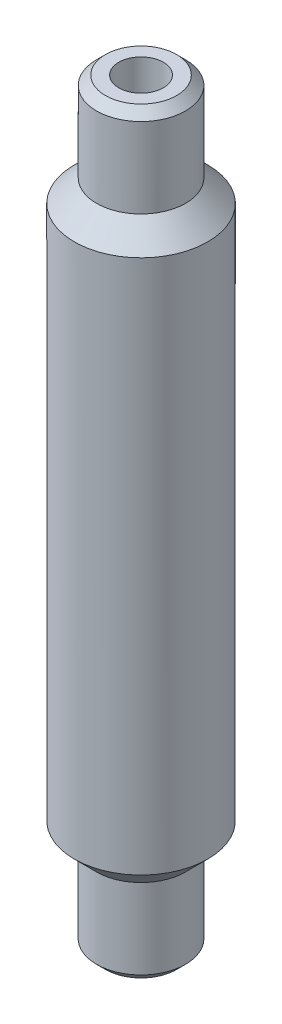
ISO-10303-21;
HEADER;
FILE_DESCRIPTION(('STEP AP214'),'2;1');
FILE_NAME('part.step','',(''),(''),'','','');
FILE_SCHEMA(('AUTOMOTIVE_DESIGN { 1 0 10303 214 1 1 1 1 }'));
ENDSEC;
DATA;
#1=APPLICATION_CONTEXT('core data for automotive mechanical design processes');
#2=APPLICATION_PROTOCOL_DEFINITION('international standard','automotive_design',2000,#1);
#3=PRODUCT_CONTEXT('',#1,'mechanical');
#4=PRODUCT('Part','Part','',(#3));
#5=PRODUCT_RELATED_PRODUCT_CATEGORY('part','',(#4));
#6=PRODUCT_DEFINITION_FORMATION('','',#4);
#7=PRODUCT_DEFINITION_CONTEXT('part definition',#1,'design');
#8=PRODUCT_DEFINITION('design','',#6,#7);
#9=PRODUCT_DEFINITION_SHAPE('','',#8);
#10=(LENGTH_UNIT() NAMED_UNIT(*) SI_UNIT(.MILLI.,.METRE.));
#11=(NAMED_UNIT(*) PLANE_ANGLE_UNIT() SI_UNIT($,.RADIAN.));
#12=(NAMED_UNIT(*) SI_UNIT($,.STERADIAN.) SOLID_ANGLE_UNIT());
#13=UNCERTAINTY_MEASURE_WITH_UNIT(LENGTH_MEASURE(1.E-05),#10,'distance_accuracy_value','');
#14=(GEOMETRIC_REPRESENTATION_CONTEXT(3) GLOBAL_UNCERTAINTY_ASSIGNED_CONTEXT((#13)) GLOBAL_UNIT_ASSIGNED_CONTEXT((#10,
#11,#12)) REPRESENTATION_CONTEXT('',''));
#15=CARTESIAN_POINT('',(0.,0.,0.));
#16=DIRECTION('',(0.,0.,1.));
#17=DIRECTION('',(1.,0.,0.));
#18=AXIS2_PLACEMENT_3D('',#15,#16,#17);
#19=CARTESIAN_POINT('',(0.,82.69732,0.));
#20=DIRECTION('',(0.,-1.,0.));
#21=DIRECTION('',(0.,0.,-1.));
#22=AXIS2_PLACEMENT_3D('',#19,#20,#21);
#23=CYLINDRICAL_SURFACE('',#22,9.525);
#24=CARTESIAN_POINT('',(0.,3.17499999999998,0.));
#25=DIRECTION('',(0.,1.,0.));
#26=DIRECTION('',(0.,0.,1.));
#27=AXIS2_PLACEMENT_3D('',#24,#25,#26);
#28=CIRCLE('',#27,9.525);
#29=CARTESIAN_POINT('',(0.,3.17499999999998,9.525));
#30=VERTEX_POINT('',#29);
#31=EDGE_CURVE('E74',#30,#30,#28,.T.);
#32=ORIENTED_EDGE('',*,*,#31,.T.);
#33=EDGE_LOOP('',(#32));
#34=FACE_BOUND('',#33,.T.);
#35=CARTESIAN_POINT('',(0.,79.52232,0.));
#36=DIRECTION('',(0.,1.,0.));
#37=DIRECTION('',(0.,0.,1.));
#38=AXIS2_PLACEMENT_3D('',#35,#36,#37);
#39=CIRCLE('',#38,9.525);
#40=CARTESIAN_POINT('',(0.,79.52232,-9.52500000000001));
#41=VERTEX_POINT('',#40);
#42=EDGE_CURVE('E80',#41,#41,#39,.F.);
#43=ORIENTED_EDGE('',*,*,#42,.T.);
#44=EDGE_LOOP('',(#43));
#45=FACE_BOUND('',#44,.T.);
#46=ADVANCED_FACE('F50',(#34,#45),#23,.T.);
#47=CARTESIAN_POINT('',(0.,82.69732,0.));
#48=DIRECTION('',(0.,-1.,0.));
#49=DIRECTION('',(0.,0.,-1.));
#50=AXIS2_PLACEMENT_3D('',#47,#48,#49);
#51=CYLINDRICAL_SURFACE('',#50,3.175);
#52=CARTESIAN_POINT('',(0.,-12.7,0.));
#53=DIRECTION('',(0.,1.,0.));
#54=DIRECTION('',(0.,0.,1.));
#55=AXIS2_PLACEMENT_3D('',#52,#53,#54);
#56=CIRCLE('',#55,3.175);
#57=CARTESIAN_POINT('',(0.,-12.7,3.175));
#58=VERTEX_POINT('',#57);
#59=EDGE_CURVE('E76',#58,#58,#56,.T.);
#60=ORIENTED_EDGE('',*,*,#59,.F.);
#61=EDGE_LOOP('',(#60));
#62=FACE_BOUND('',#61,.T.);
#63=CARTESIAN_POINT('',(0.,95.39732,0.));
#64=DIRECTION('',(0.,1.,0.));
#65=DIRECTION('',(0.,0.,1.));
#66=AXIS2_PLACEMENT_3D('',#63,#64,#65);
#67=CIRCLE('',#66,3.175);
#68=CARTESIAN_POINT('',(0.,95.39732,3.175));
#69=VERTEX_POINT('',#68);
#70=EDGE_CURVE('E85',#69,#69,#67,.T.);
#71=ORIENTED_EDGE('',*,*,#70,.T.);
#72=EDGE_LOOP('',(#71));
#73=FACE_BOUND('',#72,.T.);
#74=ADVANCED_FACE('F87',(#62,#73),#51,.F.);
#75=CARTESIAN_POINT('',(0.,3.17499999999998,0.));
#76=DIRECTION('',(0.,1.,0.));
#77=DIRECTION('',(0.,0.,1.));
#78=AXIS2_PLACEMENT_3D('',#75,#76,#77);
#79=CONICAL_SURFACE('',#78,9.525,0.785398163397451);
#80=CARTESIAN_POINT('',(0.,0.,0.));
#81=DIRECTION('',(0.,1.,0.));
#82=DIRECTION('',(0.,0.,1.));
#83=AXIS2_PLACEMENT_3D('',#80,#81,#82);
#84=CIRCLE('',#83,6.35);
#85=CARTESIAN_POINT('',(0.,0.,6.35));
#86=VERTEX_POINT('',#85);
#87=EDGE_CURVE('E72',#86,#86,#84,.F.);
#88=ORIENTED_EDGE('',*,*,#87,.F.);
#89=EDGE_LOOP('',(#88));
#90=FACE_BOUND('',#89,.T.);
#91=ORIENTED_EDGE('',*,*,#31,.F.);
#92=EDGE_LOOP('',(#91));
#93=FACE_BOUND('',#92,.T.);
#94=ADVANCED_FACE('F112',(#90,#93),#79,.T.);
#95=CARTESIAN_POINT('',(0.,82.69732,0.));
#96=DIRECTION('',(0.,-1.,0.));
#97=DIRECTION('',(0.,0.,-1.));
#98=AXIS2_PLACEMENT_3D('',#95,#96,#97);
#99=CONICAL_SURFACE('',#98,6.34999999999999,0.785398163397447);
#100=CARTESIAN_POINT('',(0.,82.69732,0.));
#101=DIRECTION('',(0.,1.,0.));
#102=DIRECTION('',(0.,0.,1.));
#103=AXIS2_PLACEMENT_3D('',#100,#101,#102);
#104=CIRCLE('',#103,6.34999999999999);
#105=CARTESIAN_POINT('',(0.,82.69732,-6.35));
#106=VERTEX_POINT('',#105);
#107=EDGE_CURVE('E70',#106,#106,#104,.T.);
#108=CARTESIAN_POINT('',(0.,79.52232,-9.52500000000001));
#109=CARTESIAN_POINT('',(0.,79.5553929166666,-9.49192708333334));
#110=CARTESIAN_POINT('',(0.,79.5884658333333,-9.45885416666667));
#111=CARTESIAN_POINT('',(0.,79.6546116666666,-9.39270833333334));
#112=CARTESIAN_POINT('',(0.,79.6876845833333,-9.35963541666667));
#113=CARTESIAN_POINT('',(0.,79.7538304166666,-9.29348958333334));
#114=CARTESIAN_POINT('',(0.,79.7869033333333,-9.26041666666667));
#115=CARTESIAN_POINT('',(0.,79.8530491666667,-9.19427083333334));
#116=CARTESIAN_POINT('',(0.,79.8861220833333,-9.16119791666667));
#117=CARTESIAN_POINT('',(0.,79.9522679166666,-9.09505208333334));
#118=CARTESIAN_POINT('',(0.,79.9853408333333,-9.06197916666667));
#119=CARTESIAN_POINT('',(0.,80.0514866666666,-8.99583333333334));
#120=CARTESIAN_POINT('',(0.,80.0845595833333,-8.96276041666668));
#121=CARTESIAN_POINT('',(0.,80.1507054166667,-8.89661458333334));
#122=CARTESIAN_POINT('',(0.,80.1837783333333,-8.86354166666667));
#123=CARTESIAN_POINT('',(0.,80.2499241666666,-8.79739583333334));
#124=CARTESIAN_POINT('',(0.,80.2829970833333,-8.76432291666667));
#125=CARTESIAN_POINT('',(0.,80.3491429166667,-8.69817708333334));
#126=CARTESIAN_POINT('',(0.,80.3822158333333,-8.66510416666667));
#127=CARTESIAN_POINT('',(0.,80.4483616666666,-8.59895833333334));
#128=CARTESIAN_POINT('',(0.,80.4814345833333,-8.56588541666667));
#129=CARTESIAN_POINT('',(0.,80.5475804166666,-8.49973958333334));
#130=CARTESIAN_POINT('',(0.,80.5806533333333,-8.46666666666667));
#131=CARTESIAN_POINT('',(0.,80.6467991666666,-8.40052083333334));
#132=CARTESIAN_POINT('',(0.,80.6798720833333,-8.36744791666667));
#133=CARTESIAN_POINT('',(0.,80.7460179166666,-8.30130208333334));
#134=CARTESIAN_POINT('',(0.,80.7790908333333,-8.26822916666667));
#135=CARTESIAN_POINT('',(0.,80.8452366666666,-8.20208333333334));
#136=CARTESIAN_POINT('',(0.,80.8783095833333,-8.16901041666667));
#137=CARTESIAN_POINT('',(0.,80.9444554166666,-8.10286458333334));
#138=CARTESIAN_POINT('',(0.,80.9775283333333,-8.06979166666667));
#139=CARTESIAN_POINT('',(0.,81.0436741666666,-8.00364583333334));
#140=CARTESIAN_POINT('',(0.,81.0767470833333,-7.97057291666667));
#141=CARTESIAN_POINT('',(0.,81.1428929166666,-7.90442708333334));
#142=CARTESIAN_POINT('',(0.,81.1759658333333,-7.87135416666667));
#143=CARTESIAN_POINT('',(0.,81.2421116666666,-7.80520833333334));
#144=CARTESIAN_POINT('',(0.,81.2751845833333,-7.77213541666667));
#145=CARTESIAN_POINT('',(0.,81.3413304166667,-7.70598958333334));
#146=CARTESIAN_POINT('',(0.,81.3744033333333,-7.67291666666667));
#147=CARTESIAN_POINT('',(0.,81.4405491666667,-7.60677083333334));
#148=CARTESIAN_POINT('',(0.,81.4736220833333,-7.57369791666667));
#149=CARTESIAN_POINT('',(0.,81.5397679166666,-7.50755208333334));
#150=CARTESIAN_POINT('',(0.,81.5728408333333,-7.47447916666667));
#151=CARTESIAN_POINT('',(0.,81.6389866666667,-7.40833333333334));
#152=CARTESIAN_POINT('',(0.,81.6720595833333,-7.37526041666667));
#153=CARTESIAN_POINT('',(0.,81.7382054166667,-7.30911458333334));
#154=CARTESIAN_POINT('',(0.,81.7712783333333,-7.27604166666667));
#155=CARTESIAN_POINT('',(0.,81.8374241666667,-7.20989583333334));
#156=CARTESIAN_POINT('',(0.,81.8704970833333,-7.17682291666667));
#157=CARTESIAN_POINT('',(0.,81.9366429166667,-7.11067708333334));
#158=CARTESIAN_POINT('',(0.,81.9697158333333,-7.07760416666667));
#159=CARTESIAN_POINT('',(0.,82.0358616666666,-7.01145833333334));
#160=CARTESIAN_POINT('',(0.,82.0689345833333,-6.97838541666667));
#161=CARTESIAN_POINT('',(0.,82.1350804166666,-6.91223958333333));
#162=CARTESIAN_POINT('',(0.,82.1681533333333,-6.87916666666667));
#163=CARTESIAN_POINT('',(0.,82.2342991666666,-6.81302083333334));
#164=CARTESIAN_POINT('',(0.,82.2673720833333,-6.77994791666667));
#165=CARTESIAN_POINT('',(0.,82.3335179166667,-6.71380208333334));
#166=CARTESIAN_POINT('',(0.,82.3665908333333,-6.68072916666667));
#167=CARTESIAN_POINT('',(0.,82.4327366666666,-6.61458333333333));
#168=CARTESIAN_POINT('',(0.,82.4658095833333,-6.58151041666667));
#169=CARTESIAN_POINT('',(0.,82.5319554166666,-6.51536458333334));
#170=CARTESIAN_POINT('',(0.,82.5650283333333,-6.48229166666667));
#171=CARTESIAN_POINT('',(0.,82.6311741666667,-6.41614583333333));
#172=CARTESIAN_POINT('',(0.,82.6642470833333,-6.38307291666667));
#173=CARTESIAN_POINT('',(0.,82.69732,-6.35));
#174=B_SPLINE_CURVE_WITH_KNOTS('',3,(#108,#109,#110,#111,#112,#113,#114,#115,#116,#117,#118,
#119,#120,#121,#122,#123,#124,#125,#126,#127,#128,#129,#130,#131,#132,#133,#134,#135,#136,#137,
#138,#139,#140,#141,#142,#143,#144,#145,#146,#147,#148,#149,#150,#151,#152,#153,#154,#155,#156,
#157,#158,#159,#160,#161,#162,#163,#164,#165,#166,#167,#168,#169,#170,#171,#172,#173),
.UNSPECIFIED.,.F.,.F.,(4,2,2,2,2,2,2,2,2,2,2,2,2,2,2,2,2,2,2,2,2,2,2,2,2,2,2,2,2,2,2,2,4),(0.,
0.140316501891708,0.280633003783418,0.420949505675127,0.561266007566825,0.701582509458535,
0.841899011350244,0.982215513241942,1.12253201513365,1.26284851702536,1.40316501891706,
1.54348152080877,1.68379802270048,1.82411452459218,1.96443102648389,2.10474752837559,
2.24506403026729,2.385380532159,2.52569703405071,2.66601353594242,2.80633003783412,
2.94664653972583,3.08696304161754,3.22727954350924,3.36759604540095,3.50791254729265,
3.64822904918435,3.78854555107606,3.92886205296777,4.06917855485947,4.20949505675118,
4.34981155864289,4.4901280605346),.UNSPECIFIED.);
#175=EDGE_CURVE('BSEAM124',#41,#106,#174,.T.);
#176=ORIENTED_EDGE('',*,*,#42,.F.);
#177=ORIENTED_EDGE('',*,*,#107,.F.);
#178=ORIENTED_EDGE('',*,*,#175,.T.);
#179=ORIENTED_EDGE('',*,*,#175,.F.);
#180=EDGE_LOOP('',(#176,#178,#177,#179));
#181=FACE_BOUND('',#180,.T.);
#182=ADVANCED_FACE('F124',(#181),#99,.T.);
#183=CARTESIAN_POINT('',(0.,-12.7,0.));
#184=DIRECTION('',(0.,1.,0.));
#185=DIRECTION('',(0.,0.,1.));
#186=AXIS2_PLACEMENT_3D('',#183,#184,#185);
#187=CYLINDRICAL_SURFACE('',#186,6.35);
#188=CARTESIAN_POINT('',(0.,-11.43,0.));
#189=DIRECTION('',(0.,1.,0.));
#190=DIRECTION('',(0.,0.,1.));
#191=AXIS2_PLACEMENT_3D('',#188,#189,#190);
#192=CIRCLE('',#191,6.35);
#193=CARTESIAN_POINT('',(0.,-11.43,6.35));
#194=VERTEX_POINT('',#193);
#195=EDGE_CURVE('E54',#194,#194,#192,.T.);
#196=ORIENTED_EDGE('',*,*,#195,.T.);
#197=EDGE_LOOP('',(#196));
#198=FACE_BOUND('',#197,.T.);
#199=ORIENTED_EDGE('',*,*,#87,.T.);
#200=EDGE_LOOP('',(#199));
#201=FACE_BOUND('',#200,.T.);
#202=ADVANCED_FACE('F105',(#198,#201),#187,.T.);
#203=CARTESIAN_POINT('',(0.,-12.7,0.));
#204=DIRECTION('',(0.,1.,0.));
#205=DIRECTION('',(0.,0.,1.));
#206=AXIS2_PLACEMENT_3D('',#203,#204,#205);
#207=PLANE('',#206);
#208=CARTESIAN_POINT('',(0.,-12.7,0.));
#209=DIRECTION('',(0.,1.,0.));
#210=DIRECTION('',(0.,0.,1.));
#211=AXIS2_PLACEMENT_3D('',#208,#209,#210);
#212=CIRCLE('',#211,5.08);
#213=CARTESIAN_POINT('',(0.,-12.7,5.08));
#214=VERTEX_POINT('',#213);
#215=EDGE_CURVE('E11',#214,#214,#212,.F.);
#216=ORIENTED_EDGE('',*,*,#215,.T.);
#217=EDGE_LOOP('',(#216));
#218=FACE_BOUND('',#217,.T.);
#219=ORIENTED_EDGE('',*,*,#59,.T.);
#220=EDGE_LOOP('',(#219));
#221=FACE_BOUND('',#220,.T.);
#222=ADVANCED_FACE('F95',(#218,#221),#207,.F.);
#223=CARTESIAN_POINT('',(0.,95.39732,0.));
#224=DIRECTION('',(0.,1.,0.));
#225=DIRECTION('',(0.,0.,1.));
#226=AXIS2_PLACEMENT_3D('',#223,#224,#225);
#227=PLANE('',#226);
#228=CARTESIAN_POINT('',(0.,95.39732,0.));
#229=DIRECTION('',(0.,1.,0.));
#230=DIRECTION('',(0.,0.,1.));
#231=AXIS2_PLACEMENT_3D('',#228,#229,#230);
#232=CIRCLE('',#231,5.08);
#233=CARTESIAN_POINT('',(0.,95.39732,5.08));
#234=VERTEX_POINT('',#233);
#235=EDGE_CURVE('E63',#234,#234,#232,.T.);
#236=ORIENTED_EDGE('',*,*,#235,.T.);
#237=EDGE_LOOP('',(#236));
#238=FACE_BOUND('',#237,.T.);
#239=ORIENTED_EDGE('',*,*,#70,.F.);
#240=EDGE_LOOP('',(#239));
#241=FACE_BOUND('',#240,.T.);
#242=ADVANCED_FACE('F90',(#238,#241),#227,.T.);
#243=CARTESIAN_POINT('',(0.,95.39732,0.));
#244=DIRECTION('',(0.,-1.,0.));
#245=DIRECTION('',(0.,0.,-1.));
#246=AXIS2_PLACEMENT_3D('',#243,#244,#245);
#247=CYLINDRICAL_SURFACE('',#246,6.35);
#248=CARTESIAN_POINT('',(0.,94.12732,0.));
#249=DIRECTION('',(0.,1.,0.));
#250=DIRECTION('',(0.,0.,1.));
#251=AXIS2_PLACEMENT_3D('',#248,#249,#250);
#252=CIRCLE('',#251,6.35);
#253=CARTESIAN_POINT('',(0.,94.12732,6.35));
#254=VERTEX_POINT('',#253);
#255=EDGE_CURVE('E56',#254,#254,#252,.F.);
#256=ORIENTED_EDGE('',*,*,#255,.T.);
#257=EDGE_LOOP('',(#256));
#258=FACE_BOUND('',#257,.T.);
#259=ORIENTED_EDGE('',*,*,#107,.T.);
#260=EDGE_LOOP('',(#259));
#261=FACE_BOUND('',#260,.T.);
#262=ADVANCED_FACE('F93',(#258,#261),#247,.T.);
#263=CARTESIAN_POINT('',(0.,95.39732,0.));
#264=DIRECTION('',(0.,-1.,0.));
#265=DIRECTION('',(0.,0.,-1.));
#266=AXIS2_PLACEMENT_3D('',#263,#264,#265);
#267=CONICAL_SURFACE('',#266,5.08,0.785398163397445);
#268=ORIENTED_EDGE('',*,*,#255,.F.);
#269=EDGE_LOOP('',(#268));
#270=FACE_BOUND('',#269,.T.);
#271=ORIENTED_EDGE('',*,*,#235,.F.);
#272=EDGE_LOOP('',(#271));
#273=FACE_BOUND('',#272,.T.);
#274=ADVANCED_FACE('F97',(#270,#273),#267,.T.);
#275=CARTESIAN_POINT('',(0.,-11.43,0.));
#276=DIRECTION('',(0.,1.,0.));
#277=DIRECTION('',(0.,0.,1.));
#278=AXIS2_PLACEMENT_3D('',#275,#276,#277);
#279=CONICAL_SURFACE('',#278,6.35,0.785398163397449);
#280=ORIENTED_EDGE('',*,*,#215,.F.);
#281=EDGE_LOOP('',(#280));
#282=FACE_BOUND('',#281,.T.);
#283=ORIENTED_EDGE('',*,*,#195,.F.);
#284=EDGE_LOOP('',(#283));
#285=FACE_BOUND('',#284,.T.);
#286=ADVANCED_FACE('F49',(#282,#285),#279,.T.);
#287=CLOSED_SHELL('',(#46,#74,#94,#182,#202,#222,#242,#262,#274,#286));
#288=MANIFOLD_SOLID_BREP('B2',#287);
#289=ADVANCED_BREP_SHAPE_REPRESENTATION('',(#18,#288),#14);
#290=SHAPE_DEFINITION_REPRESENTATION(#9,#289);
ENDSEC;
END-ISO-10303-21;
